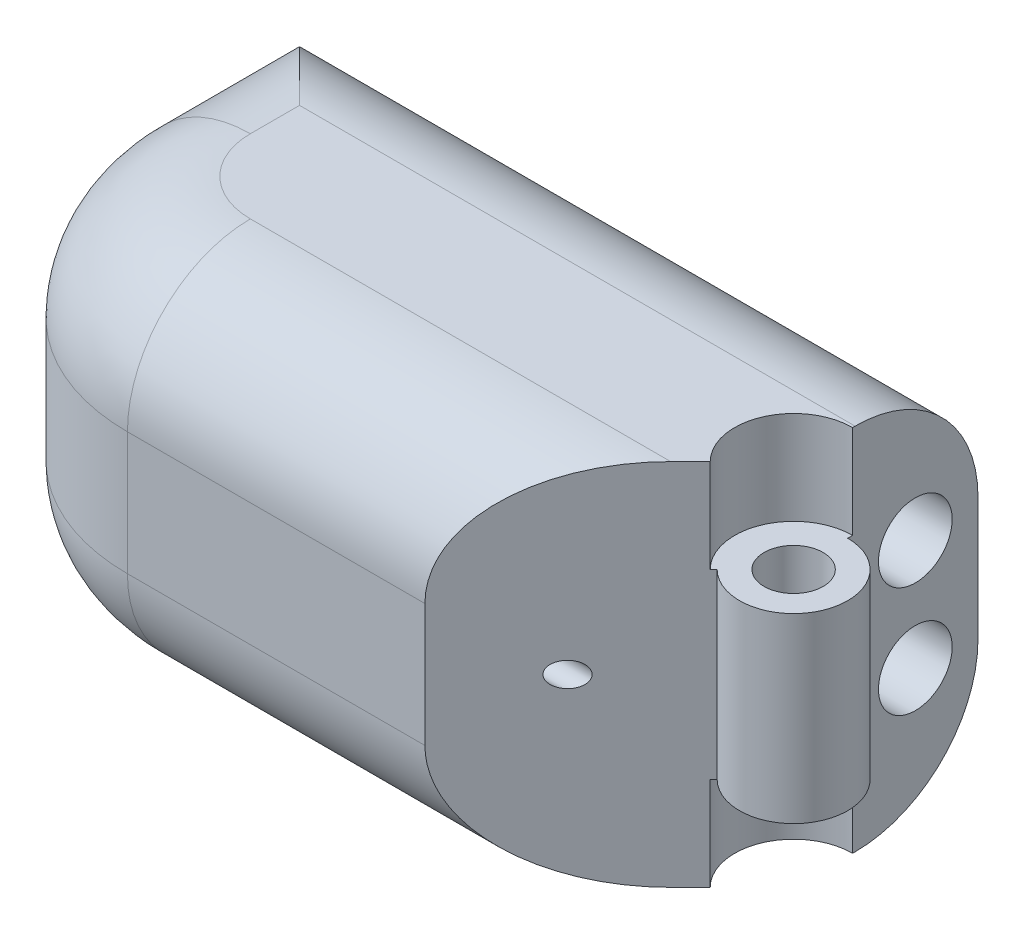
ISO-10303-21;
HEADER;
FILE_DESCRIPTION(('STEP AP214'),'2;1');
FILE_NAME('part.step','',(''),(''),'','','');
FILE_SCHEMA(('AUTOMOTIVE_DESIGN { 1 0 10303 214 1 1 1 1 }'));
ENDSEC;
DATA;
#1=APPLICATION_CONTEXT('core data for automotive mechanical design processes');
#2=APPLICATION_PROTOCOL_DEFINITION('international standard','automotive_design',2000,#1);
#3=PRODUCT_CONTEXT('',#1,'mechanical');
#4=PRODUCT('Part','Part','',(#3));
#5=PRODUCT_RELATED_PRODUCT_CATEGORY('part','',(#4));
#6=PRODUCT_DEFINITION_FORMATION('','',#4);
#7=PRODUCT_DEFINITION_CONTEXT('part definition',#1,'design');
#8=PRODUCT_DEFINITION('design','',#6,#7);
#9=PRODUCT_DEFINITION_SHAPE('','',#8);
#10=(LENGTH_UNIT() NAMED_UNIT(*) SI_UNIT(.MILLI.,.METRE.));
#11=(NAMED_UNIT(*) PLANE_ANGLE_UNIT() SI_UNIT($,.RADIAN.));
#12=(NAMED_UNIT(*) SI_UNIT($,.STERADIAN.) SOLID_ANGLE_UNIT());
#13=UNCERTAINTY_MEASURE_WITH_UNIT(LENGTH_MEASURE(1.E-05),#10,'distance_accuracy_value','');
#14=(GEOMETRIC_REPRESENTATION_CONTEXT(3) GLOBAL_UNCERTAINTY_ASSIGNED_CONTEXT((#13)) GLOBAL_UNIT_ASSIGNED_CONTEXT((#10,
#11,#12)) REPRESENTATION_CONTEXT('',''));
#15=CARTESIAN_POINT('',(0.,0.,0.));
#16=DIRECTION('',(0.,0.,1.));
#17=DIRECTION('',(1.,0.,0.));
#18=AXIS2_PLACEMENT_3D('',#15,#16,#17);
#19=CARTESIAN_POINT('',(-5.8,-7.5,-0.500000000000002));
#20=DIRECTION('',(0.,1.,0.));
#21=DIRECTION('',(0.,0.,1.));
#22=AXIS2_PLACEMENT_3D('',#19,#20,#21);
#23=CYLINDRICAL_SURFACE('',#22,8.);
#24=DIRECTION('',(0.,1.,0.));
#25=VECTOR('',#24,1.);
#26=CARTESIAN_POINT('',(-13.8,-7.5,-0.500000000000002));
#27=LINE('',#26,#25);
#28=CARTESIAN_POINT('',(-13.8,-2.5,-0.500000000000002));
#29=VERTEX_POINT('',#28);
#30=CARTESIAN_POINT('',(-13.8,2.5,-0.500000000000002));
#31=VERTEX_POINT('',#30);
#32=EDGE_CURVE('E274',#29,#31,#27,.T.);
#33=ORIENTED_EDGE('',*,*,#32,.F.);
#34=CARTESIAN_POINT('',(-5.8,-2.5,-0.500000000000002));
#35=DIRECTION('',(0.,1.,0.));
#36=DIRECTION('',(0.,0.,1.));
#37=AXIS2_PLACEMENT_3D('',#34,#35,#36);
#38=CIRCLE('',#37,8.);
#39=CARTESIAN_POINT('',(-5.8,-2.5,7.5));
#40=VERTEX_POINT('',#39);
#41=EDGE_CURVE('E360',#29,#40,#38,.T.);
#42=ORIENTED_EDGE('',*,*,#41,.T.);
#43=DIRECTION('',(0.,1.,0.));
#44=VECTOR('',#43,1.);
#45=CARTESIAN_POINT('',(-5.8,-7.5,7.5));
#46=LINE('',#45,#44);
#47=CARTESIAN_POINT('',(-5.8,2.5,7.5));
#48=VERTEX_POINT('',#47);
#49=EDGE_CURVE('E293',#48,#40,#46,.F.);
#50=ORIENTED_EDGE('',*,*,#49,.F.);
#51=CARTESIAN_POINT('',(-5.8,2.5,-0.500000000000002));
#52=DIRECTION('',(0.,1.,0.));
#53=DIRECTION('',(0.,0.,1.));
#54=AXIS2_PLACEMENT_3D('',#51,#52,#53);
#55=CIRCLE('',#54,8.);
#56=EDGE_CURVE('E331',#48,#31,#55,.F.);
#57=ORIENTED_EDGE('',*,*,#56,.T.);
#58=EDGE_LOOP('',(#33,#42,#50,#57));
#59=FACE_BOUND('',#58,.T.);
#60=CARTESIAN_POINT('',(-12.346261449814,0.,4.09852813742386));
#61=CARTESIAN_POINT('',(-12.3462594559009,0.024253895302706,4.09853129712545));
#62=CARTESIAN_POINT('',(-12.3450133846888,0.0485460323453903,4.10030644862314));
#63=CARTESIAN_POINT('',(-12.3400836449197,0.0964112502848766,4.10731190473821));
#64=CARTESIAN_POINT('',(-12.3363935841237,0.11998227552869,4.11255126992311));
#65=CARTESIAN_POINT('',(-12.3267752566269,0.165600701241695,4.12615101150825));
#66=CARTESIAN_POINT('',(-12.3208568615931,0.187654321560468,4.13449762080576));
#67=CARTESIAN_POINT('',(-12.3070360367733,0.229847510512786,4.15388257324073));
#68=CARTESIAN_POINT('',(-12.2991342305645,0.249987677990496,4.16492007034183));
#69=CARTESIAN_POINT('',(-12.2810981629868,0.289198635278913,4.18994859405726));
#70=CARTESIAN_POINT('',(-12.2708581509803,0.30813207805864,4.204077414319));
#71=CARTESIAN_POINT('',(-12.2487891993846,0.343316937255854,4.23428644509878));
#72=CARTESIAN_POINT('',(-12.2369594693582,0.359567010435803,4.25036762598014));
#73=CARTESIAN_POINT('',(-12.2098899720015,0.391847703533973,4.28684745820834));
#74=CARTESIAN_POINT('',(-12.1944122028648,0.407373036350058,4.30751566211823));
#75=CARTESIAN_POINT('',(-12.1621010097682,0.43471131561393,4.35019476315531));
#76=CARTESIAN_POINT('',(-12.145266690765,0.446521785403314,4.37220654440545));
#77=CARTESIAN_POINT('',(-12.1070731927736,0.46857443846924,4.42158369876686));
#78=CARTESIAN_POINT('',(-12.0854875114933,0.478016211790681,4.44913137763912));
#79=CARTESIAN_POINT('',(-12.0413462613595,0.491949636163987,4.50468375179927));
#80=CARTESIAN_POINT('',(-12.0187902049212,0.496438767750694,4.53268867234713));
#81=CARTESIAN_POINT('',(-11.9687683234764,0.501091819861871,4.59393167083593));
#82=CARTESIAN_POINT('',(-11.9411852838623,0.500269644232265,4.62715105133759));
#83=CARTESIAN_POINT('',(-11.8858474381472,0.492160373635172,4.69271672050588));
#84=CARTESIAN_POINT('',(-11.8580924296709,0.484863078180027,4.72506154857953));
#85=CARTESIAN_POINT('',(-11.8002673018896,0.462761360361815,4.79140073526815));
#86=CARTESIAN_POINT('',(-11.7702566708972,0.447255017555528,4.82521671283966));
#87=CARTESIAN_POINT('',(-11.7121173073736,0.408217213295802,4.88968826560566));
#88=CARTESIAN_POINT('',(-11.6839844954638,0.384703873125735,4.92035077540802));
#89=CARTESIAN_POINT('',(-11.6415117972942,0.339923375054582,4.96601437442114));
#90=CARTESIAN_POINT('',(-11.6260221693741,0.321257606267681,4.98250970343573));
#91=CARTESIAN_POINT('',(-11.5970802125822,0.280662816417026,5.01310265011423));
#92=CARTESIAN_POINT('',(-11.5836244407006,0.258739437676934,5.02720432496569));
#93=CARTESIAN_POINT('',(-11.5619665088488,0.216417307627961,5.04976911842211));
#94=CARTESIAN_POINT('',(-11.5532517546132,0.196584212732142,5.05879587223817));
#95=CARTESIAN_POINT('',(-11.5381613685516,0.15511919018929,5.07437189046351));
#96=CARTESIAN_POINT('',(-11.5317843513736,0.133488337254818,5.08092262224459));
#97=CARTESIAN_POINT('',(-11.5218258792914,0.0887222087688237,5.09113236813133));
#98=CARTESIAN_POINT('',(-11.5182674646574,0.0655761754254941,5.09476755246792));
#99=CARTESIAN_POINT('',(-11.5143900492578,0.0187375825834217,5.09872797898718));
#100=CARTESIAN_POINT('',(-11.5140687247212,-0.00495457262983814,5.09905559553426));
#101=CARTESIAN_POINT('',(-11.5165177524666,-0.0488838240418756,5.09655484893316));
#102=CARTESIAN_POINT('',(-11.5188908531837,-0.0691689919897467,5.09413200630424));
#103=CARTESIAN_POINT('',(-11.5259158855036,-0.108905766650449,5.08694122997556));
#104=CARTESIAN_POINT('',(-11.5305682043618,-0.128357231100121,5.08217289775982));
#105=CARTESIAN_POINT('',(-11.542005110601,-0.166554549803374,5.07040803858217));
#106=CARTESIAN_POINT('',(-11.5488465095774,-0.185264668642575,5.063352068931));
#107=CARTESIAN_POINT('',(-11.5642370279221,-0.221124440991583,5.04740431661685));
#108=CARTESIAN_POINT('',(-11.5727870487623,-0.238273263777221,5.03851156478085));
#109=CARTESIAN_POINT('',(-11.596155052006,-0.279580655410844,5.01407304992249));
#110=CARTESIAN_POINT('',(-11.6118888032262,-0.302619150080839,4.99750368058004));
#111=CARTESIAN_POINT('',(-11.6455204742824,-0.34474874623207,4.9617302778648));
#112=CARTESIAN_POINT('',(-11.66342374673,-0.363829756274207,4.94251971180187));
#113=CARTESIAN_POINT('',(-11.7066368620792,-0.403670376205892,4.89564195257582));
#114=CARTESIAN_POINT('',(-11.7324761536531,-0.422994200282076,4.86724277920886));
#115=CARTESIAN_POINT('',(-11.7854277502413,-0.455193766399772,4.80812918361115));
#116=CARTESIAN_POINT('',(-11.8125406064159,-0.468066688035738,4.7774137554285));
#117=CARTESIAN_POINT('',(-11.8676521838413,-0.487640856220404,4.71396091698992));
#118=CARTESIAN_POINT('',(-11.8956581136031,-0.494244470319689,4.68119972890141));
#119=CARTESIAN_POINT('',(-11.9514691542084,-0.500847315868744,4.6148127850761));
#120=CARTESIAN_POINT('',(-11.9792741196857,-0.500842168136025,4.58118647083298));
#121=CARTESIAN_POINT('',(-12.0365780754676,-0.493619651522257,4.51072267750223));
#122=CARTESIAN_POINT('',(-12.065990888735,-0.485724929300354,4.47388023400085));
#123=CARTESIAN_POINT('',(-12.122735338337,-0.461139272047784,4.40154239101862));
#124=CARTESIAN_POINT('',(-12.1500708533645,-0.444465215658998,4.36604454638272));
#125=CARTESIAN_POINT('',(-12.1928943960172,-0.408908086998164,4.30954455399933));
#126=CARTESIAN_POINT('',(-12.2093116764681,-0.392577419190106,4.28762970392975));
#127=CARTESIAN_POINT('',(-12.2401567280527,-0.355713565800689,4.24605592828365));
#128=CARTESIAN_POINT('',(-12.2545876105239,-0.335187080499814,4.22639348301431));
#129=CARTESIAN_POINT('',(-12.2788052574444,-0.293667888056944,4.19312670658413));
#130=CARTESIAN_POINT('',(-12.288965606351,-0.273267844039847,4.17905621059838));
#131=CARTESIAN_POINT('',(-12.3071160698494,-0.229848838256887,4.15378157146624));
#132=CARTESIAN_POINT('',(-12.3151054606653,-0.206829006700097,4.14257838432422));
#133=CARTESIAN_POINT('',(-12.3285843732011,-0.158514399847164,4.12360505561532));
#134=CARTESIAN_POINT('',(-12.3340554291564,-0.133204399269306,4.11586028496538));
#135=CARTESIAN_POINT('',(-12.3420878162092,-0.0812834132850258,4.10446931078656));
#136=CARTESIAN_POINT('',(-12.3446586722164,-0.0546769877629183,4.10080969111983));
#137=CARTESIAN_POINT('',(-12.34607917876,-0.0186394680524702,4.09878750801922));
#138=CARTESIAN_POINT('',(-12.3462622162217,-0.00932255900334364,4.09852692291773));
#139=CARTESIAN_POINT('',(-12.346261449814,0.,4.09852813742386));
#140=B_SPLINE_CURVE_WITH_KNOTS('',3,(#60,#61,#62,#63,#64,#65,#66,#67,#68,#69,#70,#71,#72,#73,
#74,#75,#76,#77,#78,#79,#80,#81,#82,#83,#84,#85,#86,#87,#88,#89,#90,#91,#92,#93,#94,#95,#96,#97,
#98,#99,#100,#101,#102,#103,#104,#105,#106,#107,#108,#109,#110,#111,#112,#113,#114,#115,#116,
#117,#118,#119,#120,#121,#122,#123,#124,#125,#126,#127,#128,#129,#130,#131,#132,#133,#134,#135,
#136,#137,#138,#139),.UNSPECIFIED.,.T.,.F.,(4,2,2,2,2,2,2,2,2,2,2,2,2,2,2,2,2,2,2,2,2,2,2,2,2,2,
2,2,2,2,2,2,2,2,2,2,2,2,2,4),(0.,0.0727338183593214,0.145658626789748,0.218264103783771,
0.290846782416012,0.367798558637976,0.444788739264745,0.534845157899362,0.624961489522112,
0.733305496557433,0.841704594043207,0.970739920296,1.09997888210901,1.24266100040486,
1.38502232602112,1.47274626232589,1.56031999079885,1.63045597612242,1.70055033114854,
1.77121191412271,1.84182276849514,1.90323627855959,1.96466022683883,2.02782886330338,
2.09103091606257,2.18783243338393,2.28487783584755,2.41315263802638,2.54148347453648,
2.67178153324394,2.80216593176601,2.94479652006521,3.08715389091771,3.18245124820046,
3.27759759807009,3.35762106969392,3.43767118770426,3.5182992747743,3.5986617830472,
3.62661874850493),.UNSPECIFIED.);
#141=CARTESIAN_POINT('',(-12.346261449814,0.,4.09852813742386));
#142=VERTEX_POINT('',#141);
#143=EDGE_CURVE('E53',#142,#142,#140,.T.);
#144=ORIENTED_EDGE('',*,*,#143,.T.);
#145=EDGE_LOOP('',(#144));
#146=FACE_BOUND('',#145,.T.);
#147=ADVANCED_FACE('F49',(#59,#146),#23,.T.);
#148=CARTESIAN_POINT('',(13.8,-7.5,0.));
#149=DIRECTION('',(0.,1.,0.));
#150=DIRECTION('',(0.,0.,1.));
#151=AXIS2_PLACEMENT_3D('',#148,#149,#150);
#152=CYLINDRICAL_SURFACE('',#151,2.4);
#153=CARTESIAN_POINT('',(13.8,-3.7,0.));
#154=DIRECTION('',(0.,1.,0.));
#155=DIRECTION('',(0.,0.,1.));
#156=AXIS2_PLACEMENT_3D('',#153,#154,#155);
#157=CIRCLE('',#156,2.4);
#158=CARTESIAN_POINT('',(13.8,-3.7,-2.4));
#159=VERTEX_POINT('',#158);
#160=CARTESIAN_POINT('',(12.1029437251523,-3.7,1.69705627484771));
#161=VERTEX_POINT('',#160);
#162=EDGE_CURVE('E220',#159,#161,#157,.T.);
#163=ORIENTED_EDGE('',*,*,#162,.T.);
#164=DIRECTION('',(0.,1.,0.));
#165=VECTOR('',#164,1.);
#166=CARTESIAN_POINT('',(12.1029437251523,-7.5,1.69705627484771));
#167=LINE('',#166,#165);
#168=CARTESIAN_POINT('',(12.1029437251523,-7.5,1.69705627484771));
#169=VERTEX_POINT('',#168);
#170=EDGE_CURVE('E271',#169,#161,#167,.T.);
#171=ORIENTED_EDGE('',*,*,#170,.F.);
#172=CARTESIAN_POINT('',(13.8,-7.5,0.));
#173=DIRECTION('',(0.,1.,0.));
#174=DIRECTION('',(0.,0.,1.));
#175=AXIS2_PLACEMENT_3D('',#172,#173,#174);
#176=CIRCLE('',#175,2.4);
#177=CARTESIAN_POINT('',(13.8,-7.5,-2.4));
#178=VERTEX_POINT('',#177);
#179=EDGE_CURVE('E259',#178,#169,#176,.T.);
#180=ORIENTED_EDGE('',*,*,#179,.F.);
#181=DIRECTION('',(0.,1.,0.));
#182=VECTOR('',#181,1.);
#183=CARTESIAN_POINT('',(13.8,-7.5,-2.4));
#184=LINE('',#183,#182);
#185=EDGE_CURVE('E287',#178,#159,#184,.T.);
#186=ORIENTED_EDGE('',*,*,#185,.T.);
#187=EDGE_LOOP('',(#163,#171,#180,#186));
#188=FACE_BOUND('',#187,.T.);
#189=ADVANCED_FACE('F383',(#188),#152,.F.);
#190=CARTESIAN_POINT('',(12.1029437251523,3.7,1.69705627484771));
#191=VERTEX_POINT('',#190);
#192=CARTESIAN_POINT('',(12.1029437251523,7.5,1.69705627484771));
#193=VERTEX_POINT('',#192);
#194=EDGE_CURVE('E275',#191,#193,#167,.T.);
#195=ORIENTED_EDGE('',*,*,#194,.F.);
#196=CARTESIAN_POINT('',(13.8,3.7,0.));
#197=DIRECTION('',(0.,1.,0.));
#198=DIRECTION('',(0.,0.,1.));
#199=AXIS2_PLACEMENT_3D('',#196,#197,#198);
#200=CIRCLE('',#199,2.4);
#201=CARTESIAN_POINT('',(13.8,3.7,-2.4));
#202=VERTEX_POINT('',#201);
#203=EDGE_CURVE('E205',#202,#191,#200,.T.);
#204=ORIENTED_EDGE('',*,*,#203,.F.);
#205=CARTESIAN_POINT('',(13.8,7.5,-2.4));
#206=VERTEX_POINT('',#205);
#207=EDGE_CURVE('E270',#202,#206,#184,.T.);
#208=ORIENTED_EDGE('',*,*,#207,.T.);
#209=CARTESIAN_POINT('',(13.8,7.5,0.));
#210=DIRECTION('',(0.,1.,0.));
#211=DIRECTION('',(0.,0.,1.));
#212=AXIS2_PLACEMENT_3D('',#209,#210,#211);
#213=CIRCLE('',#212,2.4);
#214=EDGE_CURVE('E243',#206,#193,#213,.T.);
#215=ORIENTED_EDGE('',*,*,#214,.T.);
#216=EDGE_LOOP('',(#195,#204,#208,#215));
#217=FACE_BOUND('',#216,.T.);
#218=ADVANCED_FACE('F389',(#217),#152,.F.);
#219=CARTESIAN_POINT('',(6.9,-7.5,6.9));
#220=DIRECTION('',(-0.707106781186547,0.,-0.707106781186548));
#221=DIRECTION('',(-0.707106781186548,0.,0.707106781186547));
#222=AXIS2_PLACEMENT_3D('',#219,#220,#221);
#223=PLANE('',#222);
#224=CARTESIAN_POINT('',(8.70147186252507,0.,5.09852813742386));
#225=CARTESIAN_POINT('',(8.70147186252507,1.,5.09852813742386));
#226=CARTESIAN_POINT('',(9.70147186252507,1.,4.09852813742386));
#227=CARTESIAN_POINT('',(9.70147186252507,0.,4.09852813742386));
#228=CARTESIAN_POINT('',(9.70147186252507,-1.,4.09852813742386));
#229=CARTESIAN_POINT('',(8.70147186252507,-1.,5.09852813742386));
#230=CARTESIAN_POINT('',(8.70147186252507,0.,5.09852813742386));
#231=(BOUNDED_CURVE() B_SPLINE_CURVE(3,(#224,#225,#226,#227,#228,#229,#230),.UNSPECIFIED.,.T.,
.F.) B_SPLINE_CURVE_WITH_KNOTS((4,3,4),(0.,0.5,1.),
.UNSPECIFIED.) CURVE() GEOMETRIC_REPRESENTATION_ITEM() RATIONAL_B_SPLINE_CURVE((1.,
0.333333333333333,0.333333333333333,1.,0.333333333333333,0.333333333333333,1.)) REPRESENTATION_ITEM(''));
#232=CARTESIAN_POINT('',(8.70147186252507,0.,5.09852813742386));
#233=VERTEX_POINT('',#232);
#234=EDGE_CURVE('E553',#233,#233,#231,.T.);
#235=ORIENTED_EDGE('',*,*,#234,.T.);
#236=EDGE_LOOP('',(#235));
#237=FACE_BOUND('',#236,.T.);
#238=DIRECTION('',(0.,1.,0.));
#239=VECTOR('',#238,1.);
#240=CARTESIAN_POINT('',(6.3,-7.5,7.5));
#241=LINE('',#240,#239);
#242=CARTESIAN_POINT('',(6.3,-2.5,7.5));
#243=VERTEX_POINT('',#242);
#244=CARTESIAN_POINT('',(6.3,2.5,7.5));
#245=VERTEX_POINT('',#244);
#246=EDGE_CURVE('E276',#243,#245,#241,.T.);
#247=ORIENTED_EDGE('',*,*,#246,.F.);
#248=CARTESIAN_POINT('',(11.3,-2.5,2.5));
#249=DIRECTION('',(-0.707106781186547,0.,-0.707106781186548));
#250=DIRECTION('',(-0.707106781186548,0.,0.707106781186547));
#251=AXIS2_PLACEMENT_3D('',#248,#249,#250);
#252=ELLIPSE('',#251,7.07106781186548,5.);
#253=CARTESIAN_POINT('',(11.3,-7.5,2.5));
#254=VERTEX_POINT('',#253);
#255=EDGE_CURVE('E11',#243,#254,#252,.F.);
#256=ORIENTED_EDGE('',*,*,#255,.T.);
#257=DIRECTION('',(-0.707106781186548,0.,0.707106781186547));
#258=VECTOR('',#257,1.);
#259=CARTESIAN_POINT('',(6.9,-7.5,6.9));
#260=LINE('',#259,#258);
#261=EDGE_CURVE('E266',#169,#254,#260,.T.);
#262=ORIENTED_EDGE('',*,*,#261,.F.);
#263=ORIENTED_EDGE('',*,*,#170,.T.);
#264=DIRECTION('',(0.707106781186548,0.,-0.707106781186546));
#265=VECTOR('',#264,1.);
#266=CARTESIAN_POINT('',(12.1029437251523,-3.7,1.69705627484771));
#267=LINE('',#266,#265);
#268=CARTESIAN_POINT('',(12.2443650813896,-3.7,1.5556349186104));
#269=VERTEX_POINT('',#268);
#270=EDGE_CURVE('E188',#161,#269,#267,.T.);
#271=ORIENTED_EDGE('',*,*,#270,.T.);
#272=DIRECTION('',(0.,1.,0.));
#273=VECTOR('',#272,1.);
#274=CARTESIAN_POINT('',(12.2443650813896,-3.7,1.5556349186104));
#275=LINE('',#274,#273);
#276=CARTESIAN_POINT('',(12.2443650813896,3.7,1.5556349186104));
#277=VERTEX_POINT('',#276);
#278=EDGE_CURVE('E181',#269,#277,#275,.T.);
#279=ORIENTED_EDGE('',*,*,#278,.T.);
#280=DIRECTION('',(0.707106781186548,0.,-0.707106781186546));
#281=VECTOR('',#280,1.);
#282=CARTESIAN_POINT('',(12.1029437251523,3.7,1.69705627484771));
#283=LINE('',#282,#281);
#284=EDGE_CURVE('E184',#191,#277,#283,.T.);
#285=ORIENTED_EDGE('',*,*,#284,.F.);
#286=ORIENTED_EDGE('',*,*,#194,.T.);
#287=DIRECTION('',(-0.707106781186548,0.,0.707106781186547));
#288=VECTOR('',#287,1.);
#289=CARTESIAN_POINT('',(6.9,7.5,6.9));
#290=LINE('',#289,#288);
#291=CARTESIAN_POINT('',(11.3,7.5,2.5));
#292=VERTEX_POINT('',#291);
#293=EDGE_CURVE('E256',#193,#292,#290,.T.);
#294=ORIENTED_EDGE('',*,*,#293,.T.);
#295=CARTESIAN_POINT('',(11.3,2.5,2.5));
#296=DIRECTION('',(-0.707106781186547,0.,-0.707106781186548));
#297=DIRECTION('',(0.707106781186548,0.,-0.707106781186547));
#298=AXIS2_PLACEMENT_3D('',#295,#296,#297);
#299=ELLIPSE('',#298,7.07106781186548,5.);
#300=EDGE_CURVE('E64',#292,#245,#299,.F.);
#301=ORIENTED_EDGE('',*,*,#300,.T.);
#302=EDGE_LOOP('',(#247,#256,#262,#263,#271,#279,#285,#286,#294,#301));
#303=FACE_BOUND('',#302,.T.);
#304=ADVANCED_FACE('F183',(#237,#303),#223,.F.);
#305=CARTESIAN_POINT('',(0.,-7.5,7.5));
#306=DIRECTION('',(0.,0.,-1.));
#307=DIRECTION('',(-1.,0.,0.));
#308=AXIS2_PLACEMENT_3D('',#305,#306,#307);
#309=PLANE('',#308);
#310=ORIENTED_EDGE('',*,*,#49,.T.);
#311=DIRECTION('',(-1.,0.,0.));
#312=VECTOR('',#311,1.);
#313=CARTESIAN_POINT('',(0.,-2.5,7.5));
#314=LINE('',#313,#312);
#315=EDGE_CURVE('E78',#40,#243,#314,.F.);
#316=ORIENTED_EDGE('',*,*,#315,.T.);
#317=ORIENTED_EDGE('',*,*,#246,.T.);
#318=DIRECTION('',(-1.,0.,0.));
#319=VECTOR('',#318,1.);
#320=CARTESIAN_POINT('',(-5.8,2.5,7.5));
#321=LINE('',#320,#319);
#322=EDGE_CURVE('E458',#245,#48,#321,.T.);
#323=ORIENTED_EDGE('',*,*,#322,.T.);
#324=EDGE_LOOP('',(#310,#316,#317,#323));
#325=FACE_BOUND('',#324,.T.);
#326=ADVANCED_FACE('F410',(#325),#309,.F.);
#327=CARTESIAN_POINT('',(-13.8,-7.5,0.));
#328=DIRECTION('',(1.,0.,0.));
#329=DIRECTION('',(0.,0.,-1.));
#330=AXIS2_PLACEMENT_3D('',#327,#328,#329);
#331=PLANE('',#330);
#332=DIRECTION('',(0.,1.,0.));
#333=VECTOR('',#332,1.);
#334=CARTESIAN_POINT('',(-13.8,-7.5,-7.5));
#335=LINE('',#334,#333);
#336=CARTESIAN_POINT('',(-13.8,-2.5,-7.5));
#337=VERTEX_POINT('',#336);
#338=CARTESIAN_POINT('',(-13.8,2.5,-7.5));
#339=VERTEX_POINT('',#338);
#340=EDGE_CURVE('E279',#337,#339,#335,.T.);
#341=ORIENTED_EDGE('',*,*,#340,.F.);
#342=DIRECTION('',(0.,0.,-1.));
#343=VECTOR('',#342,1.);
#344=CARTESIAN_POINT('',(-13.8,-2.5,0.));
#345=LINE('',#344,#343);
#346=CARTESIAN_POINT('',(-13.8,-2.5,-6.4290199457749));
#347=VERTEX_POINT('',#346);
#348=EDGE_CURVE('E319',#337,#347,#345,.F.);
#349=ORIENTED_EDGE('',*,*,#348,.T.);
#350=CARTESIAN_POINT('',(-13.8,-2.25,-4.95));
#351=DIRECTION('',(1.,0.,0.));
#352=DIRECTION('',(0.,0.,-1.));
#353=AXIS2_PLACEMENT_3D('',#350,#351,#352);
#354=CIRCLE('',#353,1.5);
#355=CARTESIAN_POINT('',(-13.8,-2.5,-3.4709800542251));
#356=VERTEX_POINT('',#355);
#357=EDGE_CURVE('E238',#356,#347,#354,.F.);
#358=ORIENTED_EDGE('',*,*,#357,.F.);
#359=DIRECTION('',(0.,0.,-1.));
#360=VECTOR('',#359,1.);
#361=CARTESIAN_POINT('',(-13.8,-2.5,0.));
#362=LINE('',#361,#360);
#363=EDGE_CURVE('E316',#356,#29,#362,.F.);
#364=ORIENTED_EDGE('',*,*,#363,.T.);
#365=ORIENTED_EDGE('',*,*,#32,.T.);
#366=DIRECTION('',(0.,0.,-1.));
#367=VECTOR('',#366,1.);
#368=CARTESIAN_POINT('',(-13.8,2.5,-7.5));
#369=LINE('',#368,#367);
#370=CARTESIAN_POINT('',(-13.8,2.5,-3.4709800542251));
#371=VERTEX_POINT('',#370);
#372=EDGE_CURVE('E312',#31,#371,#369,.T.);
#373=ORIENTED_EDGE('',*,*,#372,.T.);
#374=CARTESIAN_POINT('',(-13.8,2.25,-4.95));
#375=DIRECTION('',(1.,0.,0.));
#376=DIRECTION('',(0.,0.,-1.));
#377=AXIS2_PLACEMENT_3D('',#374,#375,#376);
#378=CIRCLE('',#377,1.5);
#379=CARTESIAN_POINT('',(-13.8,2.5,-6.4290199457749));
#380=VERTEX_POINT('',#379);
#381=EDGE_CURVE('E239',#380,#371,#378,.F.);
#382=ORIENTED_EDGE('',*,*,#381,.F.);
#383=DIRECTION('',(0.,0.,-1.));
#384=VECTOR('',#383,1.);
#385=CARTESIAN_POINT('',(-13.8,2.5,-7.5));
#386=LINE('',#385,#384);
#387=EDGE_CURVE('E309',#380,#339,#386,.T.);
#388=ORIENTED_EDGE('',*,*,#387,.T.);
#389=EDGE_LOOP('',(#341,#349,#358,#364,#365,#373,#382,#388));
#390=FACE_BOUND('',#389,.T.);
#391=ADVANCED_FACE('F406',(#390),#331,.F.);
#392=CARTESIAN_POINT('',(0.,-7.5,-7.5));
#393=DIRECTION('',(0.,0.,1.));
#394=DIRECTION('',(1.,0.,0.));
#395=AXIS2_PLACEMENT_3D('',#392,#393,#394);
#396=PLANE('',#395);
#397=DIRECTION('',(0.,1.,0.));
#398=VECTOR('',#397,1.);
#399=CARTESIAN_POINT('',(13.8,-7.5,-7.5));
#400=LINE('',#399,#398);
#401=CARTESIAN_POINT('',(13.8,-2.5,-7.5));
#402=VERTEX_POINT('',#401);
#403=CARTESIAN_POINT('',(13.8,2.5,-7.5));
#404=VERTEX_POINT('',#403);
#405=EDGE_CURVE('E283',#402,#404,#400,.T.);
#406=ORIENTED_EDGE('',*,*,#405,.F.);
#407=DIRECTION('',(1.,0.,0.));
#408=VECTOR('',#407,1.);
#409=CARTESIAN_POINT('',(0.,-2.5,-7.5));
#410=LINE('',#409,#408);
#411=EDGE_CURVE('E442',#402,#337,#410,.F.);
#412=ORIENTED_EDGE('',*,*,#411,.T.);
#413=ORIENTED_EDGE('',*,*,#340,.T.);
#414=DIRECTION('',(1.,0.,0.));
#415=VECTOR('',#414,1.);
#416=CARTESIAN_POINT('',(13.8,2.5,-7.5));
#417=LINE('',#416,#415);
#418=EDGE_CURVE('E446',#339,#404,#417,.T.);
#419=ORIENTED_EDGE('',*,*,#418,.T.);
#420=EDGE_LOOP('',(#406,#412,#413,#419));
#421=FACE_BOUND('',#420,.T.);
#422=ADVANCED_FACE('F402',(#421),#396,.F.);
#423=CARTESIAN_POINT('',(13.8,-7.5,0.));
#424=DIRECTION('',(-1.,0.,0.));
#425=DIRECTION('',(0.,0.,1.));
#426=AXIS2_PLACEMENT_3D('',#423,#424,#425);
#427=PLANE('',#426);
#428=CARTESIAN_POINT('',(13.8,-2.25,-4.95));
#429=DIRECTION('',(1.,0.,0.));
#430=DIRECTION('',(0.,0.,-1.));
#431=AXIS2_PLACEMENT_3D('',#428,#429,#430);
#432=CIRCLE('',#431,1.5);
#433=CARTESIAN_POINT('',(13.8,-2.25,-6.45));
#434=VERTEX_POINT('',#433);
#435=EDGE_CURVE('E234',#434,#434,#432,.T.);
#436=ORIENTED_EDGE('',*,*,#435,.F.);
#437=EDGE_LOOP('',(#436));
#438=FACE_BOUND('',#437,.T.);
#439=CARTESIAN_POINT('',(13.8,2.25,-4.95));
#440=DIRECTION('',(1.,0.,0.));
#441=DIRECTION('',(0.,0.,-1.));
#442=AXIS2_PLACEMENT_3D('',#439,#440,#441);
#443=CIRCLE('',#442,1.5);
#444=CARTESIAN_POINT('',(13.8,2.25,-6.45));
#445=VERTEX_POINT('',#444);
#446=EDGE_CURVE('E232',#445,#445,#443,.T.);
#447=ORIENTED_EDGE('',*,*,#446,.F.);
#448=EDGE_LOOP('',(#447));
#449=FACE_BOUND('',#448,.T.);
#450=DIRECTION('',(0.,0.,1.));
#451=VECTOR('',#450,1.);
#452=CARTESIAN_POINT('',(13.8,-7.5,0.));
#453=LINE('',#452,#451);
#454=CARTESIAN_POINT('',(13.8,-7.5,-2.5));
#455=VERTEX_POINT('',#454);
#456=EDGE_CURVE('E263',#455,#178,#453,.T.);
#457=ORIENTED_EDGE('',*,*,#456,.F.);
#458=CARTESIAN_POINT('',(13.8,-2.5,-2.5));
#459=DIRECTION('',(-1.,0.,0.));
#460=DIRECTION('',(0.,0.,1.));
#461=AXIS2_PLACEMENT_3D('',#458,#459,#460);
#462=CIRCLE('',#461,5.);
#463=EDGE_CURVE('E441',#455,#402,#462,.F.);
#464=ORIENTED_EDGE('',*,*,#463,.T.);
#465=ORIENTED_EDGE('',*,*,#405,.T.);
#466=CARTESIAN_POINT('',(13.8,2.5,-2.5));
#467=DIRECTION('',(-1.,0.,0.));
#468=DIRECTION('',(0.,0.,1.));
#469=AXIS2_PLACEMENT_3D('',#466,#467,#468);
#470=CIRCLE('',#469,5.);
#471=CARTESIAN_POINT('',(13.8,7.5,-2.5));
#472=VERTEX_POINT('',#471);
#473=EDGE_CURVE('E447',#404,#472,#470,.F.);
#474=ORIENTED_EDGE('',*,*,#473,.T.);
#475=DIRECTION('',(0.,0.,1.));
#476=VECTOR('',#475,1.);
#477=CARTESIAN_POINT('',(13.8,7.5,0.));
#478=LINE('',#477,#476);
#479=EDGE_CURVE('E253',#472,#206,#478,.T.);
#480=ORIENTED_EDGE('',*,*,#479,.T.);
#481=ORIENTED_EDGE('',*,*,#207,.F.);
#482=DIRECTION('',(0.,0.,-1.));
#483=VECTOR('',#482,1.);
#484=CARTESIAN_POINT('',(13.8,3.7,-2.4));
#485=LINE('',#484,#483);
#486=CARTESIAN_POINT('',(13.8,3.7,-2.2));
#487=VERTEX_POINT('',#486);
#488=EDGE_CURVE('E210',#487,#202,#485,.T.);
#489=ORIENTED_EDGE('',*,*,#488,.F.);
#490=DIRECTION('',(0.,1.,0.));
#491=VECTOR('',#490,1.);
#492=CARTESIAN_POINT('',(13.8,-3.7,-2.2));
#493=LINE('',#492,#491);
#494=CARTESIAN_POINT('',(13.8,-3.7,-2.2));
#495=VERTEX_POINT('',#494);
#496=EDGE_CURVE('E194',#495,#487,#493,.T.);
#497=ORIENTED_EDGE('',*,*,#496,.F.);
#498=DIRECTION('',(0.,0.,-1.));
#499=VECTOR('',#498,1.);
#500=CARTESIAN_POINT('',(13.8,-3.7,-2.4));
#501=LINE('',#500,#499);
#502=EDGE_CURVE('E195',#495,#159,#501,.T.);
#503=ORIENTED_EDGE('',*,*,#502,.T.);
#504=ORIENTED_EDGE('',*,*,#185,.F.);
#505=EDGE_LOOP('',(#457,#464,#465,#474,#480,#481,#489,#497,#503,#504));
#506=FACE_BOUND('',#505,.T.);
#507=ADVANCED_FACE('F398',(#438,#449,#506),#427,.F.);
#508=CARTESIAN_POINT('',(0.,-7.5,0.));
#509=DIRECTION('',(0.,1.,0.));
#510=DIRECTION('',(0.,0.,1.));
#511=AXIS2_PLACEMENT_3D('',#508,#509,#510);
#512=PLANE('',#511);
#513=DIRECTION('',(0.,0.,-1.));
#514=VECTOR('',#513,1.);
#515=CARTESIAN_POINT('',(-8.8,-7.5,0.));
#516=LINE('',#515,#514);
#517=CARTESIAN_POINT('',(-8.8,-7.5,-0.500000000000002));
#518=VERTEX_POINT('',#517);
#519=CARTESIAN_POINT('',(-8.8,-7.5,-2.5));
#520=VERTEX_POINT('',#519);
#521=EDGE_CURVE('E302',#518,#520,#516,.T.);
#522=ORIENTED_EDGE('',*,*,#521,.T.);
#523=DIRECTION('',(1.,0.,0.));
#524=VECTOR('',#523,1.);
#525=CARTESIAN_POINT('',(0.,-7.5,-2.5));
#526=LINE('',#525,#524);
#527=EDGE_CURVE('E306',#520,#455,#526,.T.);
#528=ORIENTED_EDGE('',*,*,#527,.T.);
#529=ORIENTED_EDGE('',*,*,#456,.T.);
#530=ORIENTED_EDGE('',*,*,#179,.T.);
#531=ORIENTED_EDGE('',*,*,#261,.T.);
#532=DIRECTION('',(-1.,0.,0.));
#533=VECTOR('',#532,1.);
#534=CARTESIAN_POINT('',(0.,-7.5,2.5));
#535=LINE('',#534,#533);
#536=CARTESIAN_POINT('',(-5.8,-7.5,2.5));
#537=VERTEX_POINT('',#536);
#538=EDGE_CURVE('E296',#254,#537,#535,.T.);
#539=ORIENTED_EDGE('',*,*,#538,.T.);
#540=CARTESIAN_POINT('',(-5.8,-7.5,-0.500000000000002));
#541=DIRECTION('',(0.,1.,0.));
#542=DIRECTION('',(0.,0.,1.));
#543=AXIS2_PLACEMENT_3D('',#540,#541,#542);
#544=CIRCLE('',#543,3.);
#545=EDGE_CURVE('E299',#537,#518,#544,.F.);
#546=ORIENTED_EDGE('',*,*,#545,.T.);
#547=EDGE_LOOP('',(#522,#528,#529,#530,#531,#539,#546));
#548=FACE_BOUND('',#547,.T.);
#549=ADVANCED_FACE('F401',(#548),#512,.F.);
#550=CARTESIAN_POINT('',(0.,7.5,0.));
#551=DIRECTION('',(0.,1.,0.));
#552=DIRECTION('',(0.,0.,1.));
#553=AXIS2_PLACEMENT_3D('',#550,#551,#552);
#554=PLANE('',#553);
#555=ORIENTED_EDGE('',*,*,#479,.F.);
#556=DIRECTION('',(1.,0.,0.));
#557=VECTOR('',#556,1.);
#558=CARTESIAN_POINT('',(-13.8,7.5,-2.5));
#559=LINE('',#558,#557);
#560=CARTESIAN_POINT('',(-8.8,7.5,-2.5));
#561=VERTEX_POINT('',#560);
#562=EDGE_CURVE('E452',#472,#561,#559,.F.);
#563=ORIENTED_EDGE('',*,*,#562,.T.);
#564=DIRECTION('',(0.,0.,-1.));
#565=VECTOR('',#564,1.);
#566=CARTESIAN_POINT('',(-8.8,7.5,-0.500000000000002));
#567=LINE('',#566,#565);
#568=CARTESIAN_POINT('',(-8.8,7.5,-0.500000000000002));
#569=VERTEX_POINT('',#568);
#570=EDGE_CURVE('E490',#561,#569,#567,.F.);
#571=ORIENTED_EDGE('',*,*,#570,.T.);
#572=CARTESIAN_POINT('',(-5.8,7.5,-0.500000000000002));
#573=DIRECTION('',(0.,1.,0.));
#574=DIRECTION('',(0.,0.,1.));
#575=AXIS2_PLACEMENT_3D('',#572,#573,#574);
#576=CIRCLE('',#575,3.);
#577=CARTESIAN_POINT('',(-5.8,7.5,2.5));
#578=VERTEX_POINT('',#577);
#579=EDGE_CURVE('E484',#569,#578,#576,.T.);
#580=ORIENTED_EDGE('',*,*,#579,.T.);
#581=DIRECTION('',(-1.,0.,0.));
#582=VECTOR('',#581,1.);
#583=CARTESIAN_POINT('',(6.3,7.5,2.5));
#584=LINE('',#583,#582);
#585=EDGE_CURVE('E359',#578,#292,#584,.F.);
#586=ORIENTED_EDGE('',*,*,#585,.T.);
#587=ORIENTED_EDGE('',*,*,#293,.F.);
#588=ORIENTED_EDGE('',*,*,#214,.F.);
#589=EDGE_LOOP('',(#555,#563,#571,#580,#586,#587,#588));
#590=FACE_BOUND('',#589,.T.);
#591=ADVANCED_FACE('F347',(#590),#554,.T.);
#592=CARTESIAN_POINT('',(-13.801,2.25,-4.95));
#593=DIRECTION('',(1.,0.,0.));
#594=DIRECTION('',(0.,0.,-1.));
#595=AXIS2_PLACEMENT_3D('',#592,#593,#594);
#596=CYLINDRICAL_SURFACE('',#595,1.5);
#597=ORIENTED_EDGE('',*,*,#446,.T.);
#598=EDGE_LOOP('',(#597));
#599=FACE_BOUND('',#598,.T.);
#600=ORIENTED_EDGE('',*,*,#381,.T.);
#601=CARTESIAN_POINT('',(-13.8,2.5,-3.4709800542251));
#602=CARTESIAN_POINT('',(-13.8000026584986,2.54092915196573,-3.4778976660426));
#603=CARTESIAN_POINT('',(-13.7994969222422,2.58154943187303,-3.48651298950124));
#604=CARTESIAN_POINT('',(-13.7975390830072,2.66190715969484,-3.50706785696248));
#605=CARTESIAN_POINT('',(-13.7960871956977,2.70164480666576,-3.51900664304814));
#606=CARTESIAN_POINT('',(-13.790428804158,2.81893037717387,-3.55962637218542));
#607=CARTESIAN_POINT('',(-13.7849187317412,2.89479820750246,-3.59315285111357));
#608=CARTESIAN_POINT('',(-13.7713174416803,3.03973977815624,-3.6720604856949));
#609=CARTESIAN_POINT('',(-13.7632270789742,3.10881575894898,-3.71743771388973));
#610=CARTESIAN_POINT('',(-13.7455921340999,3.23851561897659,-3.81880113497469));
#611=CARTESIAN_POINT('',(-13.7360470314336,3.29913645808007,-3.87479112680866));
#612=CARTESIAN_POINT('',(-13.7165232796662,3.4116704650098,-3.99731923354083));
#613=CARTESIAN_POINT('',(-13.7065397090505,3.46335006747757,-4.06407118186809));
#614=CARTESIAN_POINT('',(-13.6876838107213,3.554863411255,-4.20540716065759));
#615=CARTESIAN_POINT('',(-13.6788115470184,3.59469647039163,-4.279991641815));
#616=CARTESIAN_POINT('',(-13.6633400834855,3.6615131196679,-4.43539497997811));
#617=CARTESIAN_POINT('',(-13.6567525471303,3.68843103838792,-4.51624332157802));
#618=CARTESIAN_POINT('',(-13.6468447149906,3.72821957918306,-4.68151086891177));
#619=CARTESIAN_POINT('',(-13.643523569435,3.74109385489123,-4.76592913994318));
#620=CARTESIAN_POINT('',(-13.6406669690261,3.75218785500581,-4.93339636036728));
#621=CARTESIAN_POINT('',(-13.6410277230846,3.75080934440475,-5.0164170968047));
#622=CARTESIAN_POINT('',(-13.6452347464712,3.73441084654469,-5.18100585384418));
#623=CARTESIAN_POINT('',(-13.6490809430632,3.71939114395732,-5.26257390472545));
#624=CARTESIAN_POINT('',(-13.6596801966243,3.67642965625436,-5.42114958697412));
#625=CARTESIAN_POINT('',(-13.666404150197,3.64861704366711,-5.49819432114727));
#626=CARTESIAN_POINT('',(-13.6818791827935,3.58095064252317,-5.64657884978516));
#627=CARTESIAN_POINT('',(-13.6906305276006,3.54109527499837,-5.71791789460469));
#628=CARTESIAN_POINT('',(-13.7092955874293,3.44924370928538,-5.85486906500652));
#629=CARTESIAN_POINT('',(-13.7192335539581,3.39695956289529,-5.92028478763227));
#630=CARTESIAN_POINT('',(-13.7387794415387,3.28220087497593,-6.04157354554058));
#631=CARTESIAN_POINT('',(-13.748387240615,3.21972261534984,-6.09744308376719));
#632=CARTESIAN_POINT('',(-13.766122448791,3.0850757674051,-6.19895105489803));
#633=CARTESIAN_POINT('',(-13.7742222982649,3.0127621107157,-6.2444019885804));
#634=CARTESIAN_POINT('',(-13.7875044938593,2.86130850388722,-6.32241821733018));
#635=CARTESIAN_POINT('',(-13.7926913397766,2.78217930123264,-6.35500336328081));
#636=CARTESIAN_POINT('',(-13.7972864633697,2.66799577468297,-6.39099802063212));
#637=CARTESIAN_POINT('',(-13.7982965603301,2.63475032834613,-6.4002272968702));
#638=CARTESIAN_POINT('',(-13.7996530939794,2.56774095119099,-6.41636420910039));
#639=CARTESIAN_POINT('',(-13.8000005373147,2.53397788548233,-6.42327535341367));
#640=CARTESIAN_POINT('',(-13.8,2.50000000000001,-6.42901994577493));
#641=B_SPLINE_CURVE_WITH_KNOTS('',3,(#601,#602,#603,#604,#605,#606,#607,#608,#609,#610,#611,
#612,#613,#614,#615,#616,#617,#618,#619,#620,#621,#622,#623,#624,#625,#626,#627,#628,#629,#630,
#631,#632,#633,#634,#635,#636,#637,#638,#639,#640),.UNSPECIFIED.,.F.,.F.,(4,2,2,2,2,2,2,2,2,2,2,
2,2,2,2,2,2,2,2,4),(0.,0.12444808094223,0.248867804667795,0.496964607345673,0.744979292339386,
0.993082924880991,1.24691926612029,1.50077022147832,1.75589863679774,2.01096066136019,
2.25885292081134,2.50674000723422,2.75217729014734,2.99764676718285,3.24947965503423,
3.50140460001147,3.75755872208602,4.01331605973655,4.11679718061526,4.22012097629223),.UNSPECIFIED.);
#642=EDGE_CURVE('E351',#371,#380,#641,.T.);
#643=ORIENTED_EDGE('',*,*,#642,.T.);
#644=EDGE_LOOP('',(#600,#643));
#645=FACE_BOUND('',#644,.T.);
#646=ADVANCED_FACE('F341',(#599,#645),#596,.F.);
#647=CARTESIAN_POINT('',(-13.801,-2.25,-4.95));
#648=DIRECTION('',(1.,0.,0.));
#649=DIRECTION('',(0.,0.,-1.));
#650=AXIS2_PLACEMENT_3D('',#647,#648,#649);
#651=CYLINDRICAL_SURFACE('',#650,1.5);
#652=ORIENTED_EDGE('',*,*,#435,.T.);
#653=EDGE_LOOP('',(#652));
#654=FACE_BOUND('',#653,.T.);
#655=ORIENTED_EDGE('',*,*,#357,.T.);
#656=CARTESIAN_POINT('',(-13.8,-2.5,-6.4290199457749));
#657=CARTESIAN_POINT('',(-13.8000026584986,-2.54092915196573,-6.4221023339574));
#658=CARTESIAN_POINT('',(-13.7994969222422,-2.58154943187303,-6.41348701049876));
#659=CARTESIAN_POINT('',(-13.7975390830072,-2.66190715969484,-6.39293214303752));
#660=CARTESIAN_POINT('',(-13.7960871956977,-2.70164480666576,-6.38099335695186));
#661=CARTESIAN_POINT('',(-13.790428804158,-2.81893037717387,-6.34037362781458));
#662=CARTESIAN_POINT('',(-13.7849187317412,-2.89479820750247,-6.30684714888643));
#663=CARTESIAN_POINT('',(-13.7713174416803,-3.03973977815625,-6.2279395143051));
#664=CARTESIAN_POINT('',(-13.7632270789742,-3.10881575894898,-6.18256228611027));
#665=CARTESIAN_POINT('',(-13.7455921340999,-3.23851561897659,-6.08119886502531));
#666=CARTESIAN_POINT('',(-13.7360470314336,-3.29913645808007,-6.02520887319134));
#667=CARTESIAN_POINT('',(-13.7165232796662,-3.4116704650098,-5.90268076645917));
#668=CARTESIAN_POINT('',(-13.7065397090505,-3.46335006747757,-5.83592881813191));
#669=CARTESIAN_POINT('',(-13.6876838107213,-3.554863411255,-5.69459283934241));
#670=CARTESIAN_POINT('',(-13.6788115470184,-3.59469647039163,-5.620008358185));
#671=CARTESIAN_POINT('',(-13.6633400834855,-3.6615131196679,-5.46460502002189));
#672=CARTESIAN_POINT('',(-13.6567525471303,-3.68843103838792,-5.38375667842198));
#673=CARTESIAN_POINT('',(-13.6468447149906,-3.72821957918306,-5.21848913108823));
#674=CARTESIAN_POINT('',(-13.643523569435,-3.74109385489123,-5.13407086005682));
#675=CARTESIAN_POINT('',(-13.6406669690261,-3.75218785500581,-4.96660363963272));
#676=CARTESIAN_POINT('',(-13.6410277230846,-3.75080934440475,-4.8835829031953));
#677=CARTESIAN_POINT('',(-13.6452347464712,-3.73441084654469,-4.71899414615581));
#678=CARTESIAN_POINT('',(-13.6490809430632,-3.71939114395732,-4.63742609527455));
#679=CARTESIAN_POINT('',(-13.6596801966243,-3.67642965625436,-4.47885041302588));
#680=CARTESIAN_POINT('',(-13.666404150197,-3.64861704366711,-4.40180567885272));
#681=CARTESIAN_POINT('',(-13.6818791827935,-3.58095064252317,-4.25342115021484));
#682=CARTESIAN_POINT('',(-13.6906305276006,-3.54109527499837,-4.18208210539531));
#683=CARTESIAN_POINT('',(-13.7092955874293,-3.44924370928538,-4.04513093499348));
#684=CARTESIAN_POINT('',(-13.7192335539581,-3.39695956289529,-3.97971521236773));
#685=CARTESIAN_POINT('',(-13.7387794415387,-3.28220087497593,-3.85842645445942));
#686=CARTESIAN_POINT('',(-13.748387240615,-3.21972261534984,-3.80255691623281));
#687=CARTESIAN_POINT('',(-13.766122448791,-3.0850757674051,-3.70104894510196));
#688=CARTESIAN_POINT('',(-13.7742222982649,-3.0127621107157,-3.65559801141959));
#689=CARTESIAN_POINT('',(-13.7875044938593,-2.86130850388722,-3.57758178266982));
#690=CARTESIAN_POINT('',(-13.7926913397766,-2.78217930123264,-3.54499663671919));
#691=CARTESIAN_POINT('',(-13.7972864633697,-2.66799577468296,-3.50900197936788));
#692=CARTESIAN_POINT('',(-13.7982965603301,-2.63475032834613,-3.49977270312979));
#693=CARTESIAN_POINT('',(-13.7996530939794,-2.56774095119099,-3.48363579089961));
#694=CARTESIAN_POINT('',(-13.8000005373147,-2.53397788548233,-3.47672464658633));
#695=CARTESIAN_POINT('',(-13.8,-2.50000000000001,-3.47098005422507));
#696=B_SPLINE_CURVE_WITH_KNOTS('',3,(#656,#657,#658,#659,#660,#661,#662,#663,#664,#665,#666,
#667,#668,#669,#670,#671,#672,#673,#674,#675,#676,#677,#678,#679,#680,#681,#682,#683,#684,#685,
#686,#687,#688,#689,#690,#691,#692,#693,#694,#695),.UNSPECIFIED.,.F.,.F.,(4,2,2,2,2,2,2,2,2,2,2,
2,2,2,2,2,2,2,2,4),(0.,0.12444808094223,0.248867804667795,0.496964607345674,0.744979292339387,
0.993082924880994,1.24691926612029,1.50077022147832,1.75589863679774,2.01096066136019,
2.25885292081134,2.50674000723422,2.75217729014734,2.99764676718286,3.24947965503423,
3.50140460001147,3.75755872208602,4.01331605973655,4.11679718061526,4.22012097629223),.UNSPECIFIED.);
#697=EDGE_CURVE('E322',#347,#356,#696,.T.);
#698=ORIENTED_EDGE('',*,*,#697,.T.);
#699=EDGE_LOOP('',(#655,#698));
#700=FACE_BOUND('',#699,.T.);
#701=ADVANCED_FACE('F336',(#654,#700),#651,.F.);
#702=CARTESIAN_POINT('',(13.8,-3.7,0.));
#703=DIRECTION('',(0.,1.,0.));
#704=DIRECTION('',(0.,0.,1.));
#705=AXIS2_PLACEMENT_3D('',#702,#703,#704);
#706=CYLINDRICAL_SURFACE('',#705,2.2);
#707=ORIENTED_EDGE('',*,*,#496,.T.);
#708=CARTESIAN_POINT('',(13.8,3.7,0.));
#709=DIRECTION('',(0.,1.,0.));
#710=DIRECTION('',(0.,0.,1.));
#711=AXIS2_PLACEMENT_3D('',#708,#709,#710);
#712=CIRCLE('',#711,2.2);
#713=EDGE_CURVE('E202',#277,#487,#712,.T.);
#714=ORIENTED_EDGE('',*,*,#713,.F.);
#715=ORIENTED_EDGE('',*,*,#278,.F.);
#716=CARTESIAN_POINT('',(13.8,-3.7,0.));
#717=DIRECTION('',(0.,1.,0.));
#718=DIRECTION('',(0.,0.,1.));
#719=AXIS2_PLACEMENT_3D('',#716,#717,#718);
#720=CIRCLE('',#719,2.2);
#721=EDGE_CURVE('E225',#269,#495,#720,.T.);
#722=ORIENTED_EDGE('',*,*,#721,.T.);
#723=EDGE_LOOP('',(#707,#714,#715,#722));
#724=FACE_BOUND('',#723,.T.);
#725=ADVANCED_FACE('F208',(#724),#706,.T.);
#726=CARTESIAN_POINT('',(13.8,-3.7,0.));
#727=DIRECTION('',(0.,1.,0.));
#728=DIRECTION('',(0.,0.,1.));
#729=AXIS2_PLACEMENT_3D('',#726,#727,#728);
#730=PLANE('',#729);
#731=CARTESIAN_POINT('',(13.8,-3.7,0.));
#732=DIRECTION('',(0.,1.,0.));
#733=DIRECTION('',(0.,0.,1.));
#734=AXIS2_PLACEMENT_3D('',#731,#732,#733);
#735=CIRCLE('',#734,1.2);
#736=CARTESIAN_POINT('',(13.8,-3.7,1.2));
#737=VERTEX_POINT('',#736);
#738=EDGE_CURVE('E213',#737,#737,#735,.T.);
#739=ORIENTED_EDGE('',*,*,#738,.T.);
#740=EDGE_LOOP('',(#739));
#741=FACE_BOUND('',#740,.T.);
#742=ORIENTED_EDGE('',*,*,#162,.F.);
#743=ORIENTED_EDGE('',*,*,#502,.F.);
#744=ORIENTED_EDGE('',*,*,#721,.F.);
#745=ORIENTED_EDGE('',*,*,#270,.F.);
#746=EDGE_LOOP('',(#742,#743,#744,#745));
#747=FACE_BOUND('',#746,.T.);
#748=ADVANCED_FACE('F530',(#741,#747),#730,.F.);
#749=CARTESIAN_POINT('',(13.8,-3.7,0.));
#750=DIRECTION('',(0.,1.,0.));
#751=DIRECTION('',(0.,0.,1.));
#752=AXIS2_PLACEMENT_3D('',#749,#750,#751);
#753=CYLINDRICAL_SURFACE('',#752,1.2);
#754=ORIENTED_EDGE('',*,*,#738,.F.);
#755=EDGE_LOOP('',(#754));
#756=FACE_BOUND('',#755,.T.);
#757=CARTESIAN_POINT('',(13.8,3.7,0.));
#758=DIRECTION('',(0.,1.,0.));
#759=DIRECTION('',(0.,0.,1.));
#760=AXIS2_PLACEMENT_3D('',#757,#758,#759);
#761=CIRCLE('',#760,1.2);
#762=CARTESIAN_POINT('',(13.8,3.7,1.2));
#763=VERTEX_POINT('',#762);
#764=EDGE_CURVE('E471',#763,#763,#761,.T.);
#765=ORIENTED_EDGE('',*,*,#764,.T.);
#766=EDGE_LOOP('',(#765));
#767=FACE_BOUND('',#766,.T.);
#768=ADVANCED_FACE('F525',(#756,#767),#753,.F.);
#769=CARTESIAN_POINT('',(13.8,3.7,0.));
#770=DIRECTION('',(0.,1.,0.));
#771=DIRECTION('',(0.,0.,1.));
#772=AXIS2_PLACEMENT_3D('',#769,#770,#771);
#773=PLANE('',#772);
#774=ORIENTED_EDGE('',*,*,#203,.T.);
#775=ORIENTED_EDGE('',*,*,#284,.T.);
#776=ORIENTED_EDGE('',*,*,#713,.T.);
#777=ORIENTED_EDGE('',*,*,#488,.T.);
#778=EDGE_LOOP('',(#774,#775,#776,#777));
#779=FACE_BOUND('',#778,.T.);
#780=ORIENTED_EDGE('',*,*,#764,.F.);
#781=EDGE_LOOP('',(#780));
#782=FACE_BOUND('',#781,.T.);
#783=ADVANCED_FACE('F199',(#779,#782),#773,.T.);
#784=CARTESIAN_POINT('',(0.,-2.5,2.5));
#785=DIRECTION('',(-1.,0.,0.));
#786=DIRECTION('',(0.,0.,1.));
#787=AXIS2_PLACEMENT_3D('',#784,#785,#786);
#788=CYLINDRICAL_SURFACE('',#787,5.);
#789=ORIENTED_EDGE('',*,*,#255,.F.);
#790=ORIENTED_EDGE('',*,*,#315,.F.);
#791=CARTESIAN_POINT('',(-5.8,-2.5,2.5));
#792=DIRECTION('',(-1.,0.,0.));
#793=DIRECTION('',(0.,0.,1.));
#794=AXIS2_PLACEMENT_3D('',#791,#792,#793);
#795=CIRCLE('',#794,5.);
#796=EDGE_CURVE('E467',#537,#40,#795,.T.);
#797=ORIENTED_EDGE('',*,*,#796,.F.);
#798=ORIENTED_EDGE('',*,*,#538,.F.);
#799=EDGE_LOOP('',(#789,#790,#797,#798));
#800=FACE_BOUND('',#799,.T.);
#801=ADVANCED_FACE('F370',(#800),#788,.T.);
#802=CARTESIAN_POINT('',(-5.8,-2.5,-0.500000000000002));
#803=DIRECTION('',(0.,1.,0.));
#804=DIRECTION('',(0.,0.,1.));
#805=AXIS2_PLACEMENT_3D('',#802,#803,#804);
#806=DEGENERATE_TOROIDAL_SURFACE('',#805,3.,5.,.T.);
#807=ORIENTED_EDGE('',*,*,#796,.T.);
#808=ORIENTED_EDGE('',*,*,#41,.F.);
#809=CARTESIAN_POINT('',(-8.8,-2.5,-0.500000000000002));
#810=DIRECTION('',(0.,0.,-1.));
#811=DIRECTION('',(-1.,0.,0.));
#812=AXIS2_PLACEMENT_3D('',#809,#810,#811);
#813=CIRCLE('',#812,5.);
#814=EDGE_CURVE('E430',#518,#29,#813,.T.);
#815=ORIENTED_EDGE('',*,*,#814,.F.);
#816=ORIENTED_EDGE('',*,*,#545,.F.);
#817=EDGE_LOOP('',(#807,#808,#815,#816));
#818=FACE_BOUND('',#817,.T.);
#819=ADVANCED_FACE('F516',(#818),#806,.T.);
#820=CARTESIAN_POINT('',(0.,-2.5,-2.5));
#821=DIRECTION('',(1.,0.,0.));
#822=DIRECTION('',(0.,0.,-1.));
#823=AXIS2_PLACEMENT_3D('',#820,#821,#822);
#824=CYLINDRICAL_SURFACE('',#823,5.);
#825=ORIENTED_EDGE('',*,*,#463,.F.);
#826=ORIENTED_EDGE('',*,*,#527,.F.);
#827=CARTESIAN_POINT('',(-8.8,-2.5,-2.5));
#828=DIRECTION('',(0.707106781186547,0.,-0.707106781186548));
#829=DIRECTION('',(0.707106781186548,0.,0.707106781186547));
#830=AXIS2_PLACEMENT_3D('',#827,#828,#829);
#831=ELLIPSE('',#830,7.07106781186547,5.);
#832=EDGE_CURVE('E433',#337,#520,#831,.F.);
#833=ORIENTED_EDGE('',*,*,#832,.F.);
#834=ORIENTED_EDGE('',*,*,#411,.F.);
#835=EDGE_LOOP('',(#825,#826,#833,#834));
#836=FACE_BOUND('',#835,.T.);
#837=ADVANCED_FACE('F440',(#836),#824,.T.);
#838=CARTESIAN_POINT('',(-8.8,-2.5,0.));
#839=DIRECTION('',(0.,0.,-1.));
#840=DIRECTION('',(-1.,0.,0.));
#841=AXIS2_PLACEMENT_3D('',#838,#839,#840);
#842=CYLINDRICAL_SURFACE('',#841,5.);
#843=ORIENTED_EDGE('',*,*,#697,.F.);
#844=ORIENTED_EDGE('',*,*,#348,.F.);
#845=ORIENTED_EDGE('',*,*,#832,.T.);
#846=ORIENTED_EDGE('',*,*,#521,.F.);
#847=ORIENTED_EDGE('',*,*,#814,.T.);
#848=ORIENTED_EDGE('',*,*,#363,.F.);
#849=EDGE_LOOP('',(#843,#844,#845,#846,#847,#848));
#850=FACE_BOUND('',#849,.T.);
#851=ADVANCED_FACE('F333',(#850),#842,.T.);
#852=CARTESIAN_POINT('',(0.,2.5,2.5));
#853=DIRECTION('',(1.,0.,0.));
#854=DIRECTION('',(0.,0.,-1.));
#855=AXIS2_PLACEMENT_3D('',#852,#853,#854);
#856=CYLINDRICAL_SURFACE('',#855,5.);
#857=ORIENTED_EDGE('',*,*,#300,.F.);
#858=ORIENTED_EDGE('',*,*,#585,.F.);
#859=CARTESIAN_POINT('',(-5.8,2.5,2.5));
#860=DIRECTION('',(-1.,0.,0.));
#861=DIRECTION('',(0.,0.,1.));
#862=AXIS2_PLACEMENT_3D('',#859,#860,#861);
#863=CIRCLE('',#862,5.);
#864=EDGE_CURVE('E437',#48,#578,#863,.T.);
#865=ORIENTED_EDGE('',*,*,#864,.F.);
#866=ORIENTED_EDGE('',*,*,#322,.F.);
#867=EDGE_LOOP('',(#857,#858,#865,#866));
#868=FACE_BOUND('',#867,.T.);
#869=ADVANCED_FACE('F51',(#868),#856,.T.);
#870=CARTESIAN_POINT('',(-5.8,2.5,-0.500000000000002));
#871=DIRECTION('',(0.,1.,0.));
#872=DIRECTION('',(0.,0.,1.));
#873=AXIS2_PLACEMENT_3D('',#870,#871,#872);
#874=DEGENERATE_TOROIDAL_SURFACE('',#873,3.,5.,.T.);
#875=ORIENTED_EDGE('',*,*,#864,.T.);
#876=ORIENTED_EDGE('',*,*,#579,.F.);
#877=CARTESIAN_POINT('',(-8.8,2.5,-0.500000000000002));
#878=DIRECTION('',(0.,0.,-1.));
#879=DIRECTION('',(-1.,0.,0.));
#880=AXIS2_PLACEMENT_3D('',#877,#878,#879);
#881=CIRCLE('',#880,5.);
#882=EDGE_CURVE('E476',#31,#569,#881,.T.);
#883=ORIENTED_EDGE('',*,*,#882,.F.);
#884=ORIENTED_EDGE('',*,*,#56,.F.);
#885=EDGE_LOOP('',(#875,#876,#883,#884));
#886=FACE_BOUND('',#885,.T.);
#887=ADVANCED_FACE('F373',(#886),#874,.T.);
#888=CARTESIAN_POINT('',(0.,2.5,-2.5));
#889=DIRECTION('',(-1.,0.,0.));
#890=DIRECTION('',(0.,0.,1.));
#891=AXIS2_PLACEMENT_3D('',#888,#889,#890);
#892=CYLINDRICAL_SURFACE('',#891,5.);
#893=ORIENTED_EDGE('',*,*,#473,.F.);
#894=ORIENTED_EDGE('',*,*,#418,.F.);
#895=CARTESIAN_POINT('',(-8.8,2.5,-2.5));
#896=DIRECTION('',(-0.707106781186547,0.,0.707106781186548));
#897=DIRECTION('',(-0.707106781186548,0.,-0.707106781186547));
#898=AXIS2_PLACEMENT_3D('',#895,#896,#897);
#899=ELLIPSE('',#898,7.07106781186547,5.);
#900=EDGE_CURVE('E472',#561,#339,#899,.T.);
#901=ORIENTED_EDGE('',*,*,#900,.F.);
#902=ORIENTED_EDGE('',*,*,#562,.F.);
#903=EDGE_LOOP('',(#893,#894,#901,#902));
#904=FACE_BOUND('',#903,.T.);
#905=ADVANCED_FACE('F368',(#904),#892,.T.);
#906=CARTESIAN_POINT('',(-8.8,2.5,0.));
#907=DIRECTION('',(0.,0.,1.));
#908=DIRECTION('',(1.,0.,0.));
#909=AXIS2_PLACEMENT_3D('',#906,#907,#908);
#910=CYLINDRICAL_SURFACE('',#909,5.);
#911=ORIENTED_EDGE('',*,*,#882,.T.);
#912=ORIENTED_EDGE('',*,*,#570,.F.);
#913=ORIENTED_EDGE('',*,*,#900,.T.);
#914=ORIENTED_EDGE('',*,*,#387,.F.);
#915=ORIENTED_EDGE('',*,*,#642,.F.);
#916=ORIENTED_EDGE('',*,*,#372,.F.);
#917=EDGE_LOOP('',(#911,#912,#913,#914,#915,#916));
#918=FACE_BOUND('',#917,.T.);
#919=ADVANCED_FACE('F362',(#918),#910,.T.);
#920=CARTESIAN_POINT('',(-13.8,0.,4.59852813742386));
#921=DIRECTION('',(1.,0.,0.));
#922=DIRECTION('',(0.,0.,-1.));
#923=AXIS2_PLACEMENT_3D('',#920,#921,#922);
#924=CYLINDRICAL_SURFACE('',#923,0.5);
#925=ORIENTED_EDGE('',*,*,#143,.F.);
#926=EDGE_LOOP('',(#925));
#927=FACE_BOUND('',#926,.T.);
#928=ORIENTED_EDGE('',*,*,#234,.F.);
#929=EDGE_LOOP('',(#928));
#930=FACE_BOUND('',#929,.T.);
#931=ADVANCED_FACE('F367',(#927,#930),#924,.F.);
#932=CLOSED_SHELL('',(#147,#189,#218,#304,#326,#391,#422,#507,#549,#591,#646,#701,#725,#748,
#768,#783,#801,#819,#837,#851,#869,#887,#905,#919,#931));
#933=MANIFOLD_SOLID_BREP('B2',#932);
#934=ADVANCED_BREP_SHAPE_REPRESENTATION('',(#18,#933),#14);
#935=SHAPE_DEFINITION_REPRESENTATION(#9,#934);
ENDSEC;
END-ISO-10303-21;
